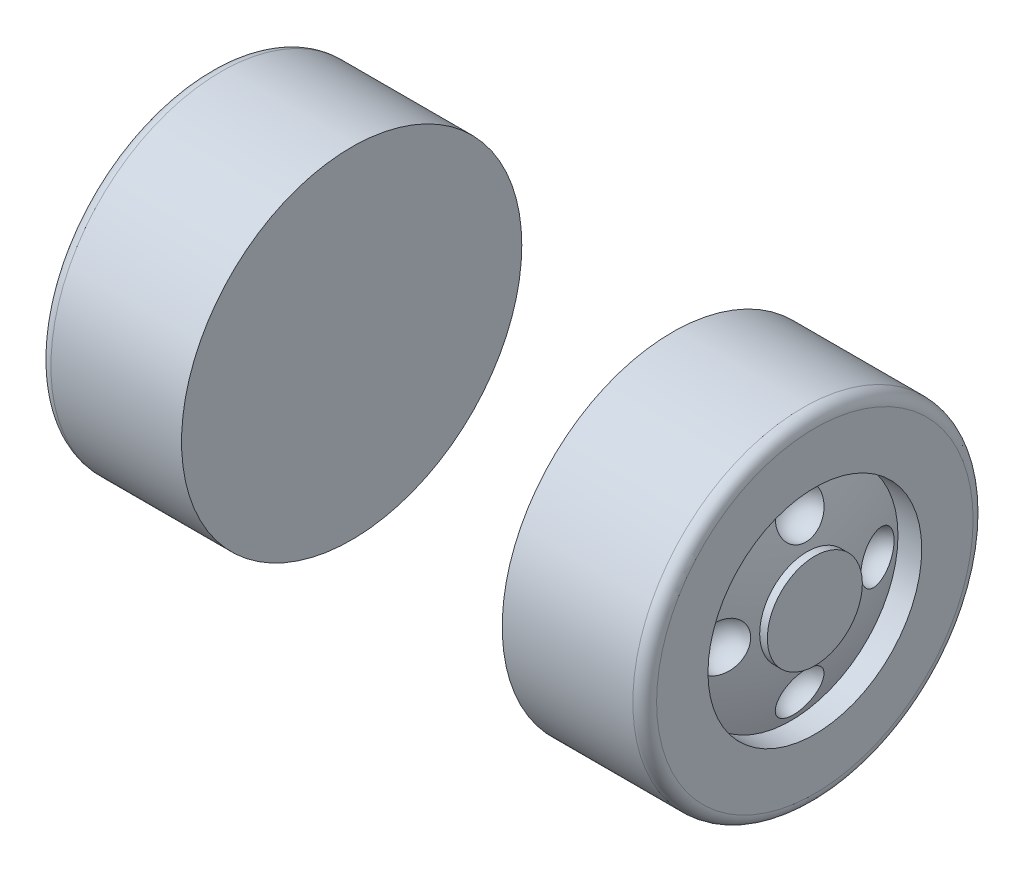
ISO-10303-21;
HEADER;
FILE_DESCRIPTION(('STEP AP214'),'2;1');
FILE_NAME('part.step','',(''),(''),'','','');
FILE_SCHEMA(('AUTOMOTIVE_DESIGN { 1 0 10303 214 1 1 1 1 }'));
ENDSEC;
DATA;
#1=APPLICATION_CONTEXT('core data for automotive mechanical design processes');
#2=APPLICATION_PROTOCOL_DEFINITION('international standard','automotive_design',2000,#1);
#3=PRODUCT_CONTEXT('',#1,'mechanical');
#4=PRODUCT('Part','Part','',(#3));
#5=PRODUCT_RELATED_PRODUCT_CATEGORY('part','',(#4));
#6=PRODUCT_DEFINITION_FORMATION('','',#4);
#7=PRODUCT_DEFINITION_CONTEXT('part definition',#1,'design');
#8=PRODUCT_DEFINITION('design','',#6,#7);
#9=PRODUCT_DEFINITION_SHAPE('','',#8);
#10=(LENGTH_UNIT() NAMED_UNIT(*) SI_UNIT(.MILLI.,.METRE.));
#11=(NAMED_UNIT(*) PLANE_ANGLE_UNIT() SI_UNIT($,.RADIAN.));
#12=(NAMED_UNIT(*) SI_UNIT($,.STERADIAN.) SOLID_ANGLE_UNIT());
#13=UNCERTAINTY_MEASURE_WITH_UNIT(LENGTH_MEASURE(1.E-05),#10,'distance_accuracy_value','');
#14=(GEOMETRIC_REPRESENTATION_CONTEXT(3) GLOBAL_UNCERTAINTY_ASSIGNED_CONTEXT((#13)) GLOBAL_UNIT_ASSIGNED_CONTEXT((#10,
#11,#12)) REPRESENTATION_CONTEXT('',''));
#15=CARTESIAN_POINT('',(0.,0.,0.));
#16=DIRECTION('',(0.,0.,1.));
#17=DIRECTION('',(1.,0.,0.));
#18=AXIS2_PLACEMENT_3D('',#15,#16,#17);
#19=CARTESIAN_POINT('',(-65.0880962103094,-87.375,-14.));
#20=DIRECTION('',(-1.,0.,0.));
#21=DIRECTION('',(0.,0.,1.));
#22=AXIS2_PLACEMENT_3D('',#19,#20,#21);
#23=SPHERICAL_SURFACE('',#22,12.5);
#24=CARTESIAN_POINT('',(-77.1091542566843,-87.375,-10.7202187542405));
#25=DIRECTION('',(0.964737111038161,0.,-0.263215323614989));
#26=DIRECTION('',(-0.263215323614989,0.,-0.964737111038161));
#27=AXIS2_PLACEMENT_3D('',#24,#25,#26);
#28=CIRCLE('',#27,0.993578595607188);
#29=CARTESIAN_POINT('',(-77.370679368264,-87.375,-11.6787608981559));
#30=VERTEX_POINT('',#29);
#31=EDGE_CURVE('E71',#30,#30,#28,.F.);
#32=ORIENTED_EDGE('',*,*,#31,.F.);
#33=EDGE_LOOP('',(#32));
#34=FACE_BOUND('',#33,.T.);
#35=CARTESIAN_POINT('',(-77.1091542566843,-90.6547812457595,-14.));
#36=DIRECTION('',(0.964737111038161,0.263215323614989,0.));
#37=DIRECTION('',(-0.263215323614989,0.964737111038161,0.));
#38=AXIS2_PLACEMENT_3D('',#35,#36,#37);
#39=CIRCLE('',#38,0.993578595607188);
#40=CARTESIAN_POINT('',(-77.370679368264,-89.6962391018441,-14.));
#41=VERTEX_POINT('',#40);
#42=EDGE_CURVE('E77',#41,#41,#39,.F.);
#43=ORIENTED_EDGE('',*,*,#42,.F.);
#44=EDGE_LOOP('',(#43));
#45=FACE_BOUND('',#44,.T.);
#46=CARTESIAN_POINT('',(-77.4270588895624,-87.375,-14.));
#47=DIRECTION('',(-1.,0.,0.));
#48=DIRECTION('',(0.,0.,1.));
#49=AXIS2_PLACEMENT_3D('',#46,#47,#48);
#50=CIRCLE('',#49,2.);
#51=CARTESIAN_POINT('',(-77.4270588895624,-87.375,-12.));
#52=VERTEX_POINT('',#51);
#53=EDGE_CURVE('E60',#52,#52,#50,.F.);
#54=ORIENTED_EDGE('',*,*,#53,.T.);
#55=EDGE_LOOP('',(#54));
#56=FACE_BOUND('',#55,.T.);
#57=CARTESIAN_POINT('',(-76.75,-87.375,-14.));
#58=DIRECTION('',(1.,0.,0.));
#59=DIRECTION('',(0.,0.,-1.));
#60=AXIS2_PLACEMENT_3D('',#57,#58,#59);
#61=CIRCLE('',#60,4.5);
#62=CARTESIAN_POINT('',(-76.75,-87.375,-18.5));
#63=VERTEX_POINT('',#62);
#64=EDGE_CURVE('E82',#63,#63,#61,.T.);
#65=ORIENTED_EDGE('',*,*,#64,.F.);
#66=EDGE_LOOP('',(#65));
#67=FACE_BOUND('',#66,.T.);
#68=CARTESIAN_POINT('',(-77.1091542566843,-87.375,-17.2797812457595));
#69=DIRECTION('',(0.964737111038161,0.,0.263215323614989));
#70=DIRECTION('',(0.263215323614989,0.,-0.964737111038161));
#71=AXIS2_PLACEMENT_3D('',#68,#69,#70);
#72=CIRCLE('',#71,0.993578595607188);
#73=CARTESIAN_POINT('',(-76.8476291451046,-87.375,-18.2383233896749));
#74=VERTEX_POINT('',#73);
#75=EDGE_CURVE('E74',#74,#74,#72,.F.);
#76=ORIENTED_EDGE('',*,*,#75,.F.);
#77=EDGE_LOOP('',(#76));
#78=FACE_BOUND('',#77,.T.);
#79=CARTESIAN_POINT('',(-77.1091542566843,-84.0952187542405,-14.));
#80=DIRECTION('',(0.964737111038161,-0.263215323614989,0.));
#81=DIRECTION('',(0.263215323614989,0.964737111038161,0.));
#82=AXIS2_PLACEMENT_3D('',#79,#80,#81);
#83=CIRCLE('',#82,0.993578595607188);
#84=CARTESIAN_POINT('',(-76.8476291451046,-83.1366766103251,-14.));
#85=VERTEX_POINT('',#84);
#86=EDGE_CURVE('E67',#85,#85,#83,.F.);
#87=ORIENTED_EDGE('',*,*,#86,.F.);
#88=EDGE_LOOP('',(#87));
#89=FACE_BOUND('',#88,.T.);
#90=ADVANCED_FACE('F49',(#34,#45,#56,#67,#78,#89),#23,.T.);
#91=CARTESIAN_POINT('',(-77.75,-87.375,-14.));
#92=DIRECTION('',(1.,0.,0.));
#93=DIRECTION('',(0.,0.,1.));
#94=AXIS2_PLACEMENT_3D('',#91,#92,#93);
#95=CYLINDRICAL_SURFACE('',#94,7.1625);
#96=CARTESIAN_POINT('',(-77.25,-87.375,-14.));
#97=DIRECTION('',(1.,0.,0.));
#98=DIRECTION('',(0.,0.,-1.));
#99=AXIS2_PLACEMENT_3D('',#96,#97,#98);
#100=CIRCLE('',#99,7.1625);
#101=CARTESIAN_POINT('',(-77.25,-87.375,-21.1625));
#102=VERTEX_POINT('',#101);
#103=EDGE_CURVE('E11',#102,#102,#100,.F.);
#104=ORIENTED_EDGE('',*,*,#103,.F.);
#105=EDGE_LOOP('',(#104));
#106=FACE_BOUND('',#105,.T.);
#107=CARTESIAN_POINT('',(-71.75,-87.375,-14.));
#108=DIRECTION('',(1.,0.,0.));
#109=DIRECTION('',(0.,0.,-1.));
#110=AXIS2_PLACEMENT_3D('',#107,#108,#109);
#111=CIRCLE('',#110,7.1625);
#112=CARTESIAN_POINT('',(-71.75,-87.375,-21.1625));
#113=VERTEX_POINT('',#112);
#114=EDGE_CURVE('E64',#113,#113,#111,.T.);
#115=ORIENTED_EDGE('',*,*,#114,.F.);
#116=EDGE_LOOP('',(#115));
#117=FACE_BOUND('',#116,.T.);
#118=ADVANCED_FACE('F108',(#106,#117),#95,.T.);
#119=CARTESIAN_POINT('',(-77.75,0.,0.));
#120=DIRECTION('',(-1.,0.,0.));
#121=DIRECTION('',(0.,0.,-1.));
#122=AXIS2_PLACEMENT_3D('',#119,#120,#121);
#123=PLANE('',#122);
#124=CARTESIAN_POINT('',(-77.75,-87.375,-14.));
#125=DIRECTION('',(1.,0.,0.));
#126=DIRECTION('',(0.,0.,-1.));
#127=AXIS2_PLACEMENT_3D('',#124,#125,#126);
#128=CIRCLE('',#127,6.6625);
#129=CARTESIAN_POINT('',(-77.75,-87.375,-20.6625));
#130=VERTEX_POINT('',#129);
#131=EDGE_CURVE('E56',#130,#130,#128,.T.);
#132=ORIENTED_EDGE('',*,*,#131,.F.);
#133=EDGE_LOOP('',(#132));
#134=FACE_BOUND('',#133,.T.);
#135=CARTESIAN_POINT('',(-77.75,-87.375,-14.));
#136=DIRECTION('',(1.,0.,0.));
#137=DIRECTION('',(0.,0.,-1.));
#138=AXIS2_PLACEMENT_3D('',#135,#136,#137);
#139=CIRCLE('',#138,4.5);
#140=CARTESIAN_POINT('',(-77.75,-87.375,-18.5));
#141=VERTEX_POINT('',#140);
#142=EDGE_CURVE('E83',#141,#141,#139,.T.);
#143=ORIENTED_EDGE('',*,*,#142,.T.);
#144=EDGE_LOOP('',(#143));
#145=FACE_BOUND('',#144,.T.);
#146=ADVANCED_FACE('F114',(#134,#145),#123,.T.);
#147=CARTESIAN_POINT('',(-71.75,0.,0.));
#148=DIRECTION('',(-1.,0.,0.));
#149=DIRECTION('',(0.,0.,-1.));
#150=AXIS2_PLACEMENT_3D('',#147,#148,#149);
#151=PLANE('',#150);
#152=ORIENTED_EDGE('',*,*,#114,.T.);
#153=EDGE_LOOP('',(#152));
#154=FACE_BOUND('',#153,.T.);
#155=ADVANCED_FACE('F121',(#154),#151,.F.);
#156=CARTESIAN_POINT('',(-76.75,-87.375,-14.));
#157=DIRECTION('',(-1.,0.,0.));
#158=DIRECTION('',(0.,0.,-1.));
#159=AXIS2_PLACEMENT_3D('',#156,#157,#158);
#160=CYLINDRICAL_SURFACE('',#159,4.5);
#161=ORIENTED_EDGE('',*,*,#64,.T.);
#162=EDGE_LOOP('',(#161));
#163=FACE_BOUND('',#162,.T.);
#164=ORIENTED_EDGE('',*,*,#142,.F.);
#165=EDGE_LOOP('',(#164));
#166=FACE_BOUND('',#165,.T.);
#167=ADVANCED_FACE('F104',(#163,#166),#160,.F.);
#168=CARTESIAN_POINT('',(-76.75,-87.375,-14.));
#169=DIRECTION('',(-1.,0.,0.));
#170=DIRECTION('',(0.,0.,-1.));
#171=AXIS2_PLACEMENT_3D('',#168,#169,#170);
#172=CYLINDRICAL_SURFACE('',#171,2.);
#173=ORIENTED_EDGE('',*,*,#53,.F.);
#174=EDGE_LOOP('',(#173));
#175=FACE_BOUND('',#174,.T.);
#176=CARTESIAN_POINT('',(-77.75,-87.375,-14.));
#177=DIRECTION('',(1.,0.,0.));
#178=DIRECTION('',(0.,0.,-1.));
#179=AXIS2_PLACEMENT_3D('',#176,#177,#178);
#180=CIRCLE('',#179,2.);
#181=CARTESIAN_POINT('',(-77.75,-87.375,-16.));
#182=VERTEX_POINT('',#181);
#183=EDGE_CURVE('E70',#182,#182,#180,.T.);
#184=ORIENTED_EDGE('',*,*,#183,.T.);
#185=EDGE_LOOP('',(#184));
#186=FACE_BOUND('',#185,.T.);
#187=ADVANCED_FACE('F91',(#175,#186),#172,.T.);
#188=CARTESIAN_POINT('',(-77.75,-87.375,-14.));
#189=DIRECTION('',(-1.,0.,0.));
#190=DIRECTION('',(0.,0.,-1.));
#191=AXIS2_PLACEMENT_3D('',#188,#189,#190);
#192=PLANE('',#191);
#193=ORIENTED_EDGE('',*,*,#183,.F.);
#194=EDGE_LOOP('',(#193));
#195=FACE_BOUND('',#194,.T.);
#196=ADVANCED_FACE('F93',(#195),#192,.T.);
#197=CARTESIAN_POINT('',(-77.,-90.625,-14.));
#198=DIRECTION('',(0.,1.,0.));
#199=DIRECTION('',(0.,0.,-1.));
#200=AXIS2_PLACEMENT_3D('',#197,#198,#199);
#201=SPHERICAL_SURFACE('',#200,1.);
#202=CARTESIAN_POINT('',(-77.,-90.625,-14.));
#203=DIRECTION('',(0.964737111038161,0.263215323614989,0.));
#204=DIRECTION('',(-0.263215323614989,0.964737111038161,0.));
#205=AXIS2_PLACEMENT_3D('',#202,#203,#204);
#206=SPHERICAL_SURFACE('',#205,1.);
#207=ORIENTED_EDGE('',*,*,#42,.T.);
#208=EDGE_LOOP('',(#207));
#209=FACE_BOUND('',#208,.T.);
#210=ADVANCED_FACE('F95',(#209),#206,.F.);
#211=CARTESIAN_POINT('',(-77.,-87.375,-17.25));
#212=DIRECTION('',(0.,0.,1.));
#213=DIRECTION('',(0.,1.,0.));
#214=AXIS2_PLACEMENT_3D('',#211,#212,#213);
#215=SPHERICAL_SURFACE('',#214,1.);
#216=CARTESIAN_POINT('',(-77.,-87.375,-17.25));
#217=DIRECTION('',(0.964737111038161,0.,0.263215323614989));
#218=DIRECTION('',(0.263215323614989,0.,-0.964737111038161));
#219=AXIS2_PLACEMENT_3D('',#216,#217,#218);
#220=SPHERICAL_SURFACE('',#219,1.);
#221=ORIENTED_EDGE('',*,*,#75,.T.);
#222=EDGE_LOOP('',(#221));
#223=FACE_BOUND('',#222,.T.);
#224=ADVANCED_FACE('F101',(#223),#220,.F.);
#225=CARTESIAN_POINT('',(-77.,-87.375,-10.75));
#226=DIRECTION('',(0.,0.,-1.));
#227=DIRECTION('',(0.,-1.,0.));
#228=AXIS2_PLACEMENT_3D('',#225,#226,#227);
#229=SPHERICAL_SURFACE('',#228,1.);
#230=CARTESIAN_POINT('',(-77.,-87.375,-10.75));
#231=DIRECTION('',(0.964737111038161,0.,-0.263215323614989));
#232=DIRECTION('',(-0.263215323614989,0.,-0.964737111038161));
#233=AXIS2_PLACEMENT_3D('',#230,#231,#232);
#234=SPHERICAL_SURFACE('',#233,1.);
#235=ORIENTED_EDGE('',*,*,#31,.T.);
#236=EDGE_LOOP('',(#235));
#237=FACE_BOUND('',#236,.T.);
#238=ADVANCED_FACE('F164',(#237),#234,.F.);
#239=CARTESIAN_POINT('',(-77.,-84.125,-14.));
#240=DIRECTION('',(0.,-1.,0.));
#241=DIRECTION('',(0.,0.,1.));
#242=AXIS2_PLACEMENT_3D('',#239,#240,#241);
#243=SPHERICAL_SURFACE('',#242,1.);
#244=CARTESIAN_POINT('',(-77.,-84.125,-14.));
#245=DIRECTION('',(0.964737111038161,-0.263215323614989,0.));
#246=DIRECTION('',(0.263215323614989,0.964737111038161,0.));
#247=AXIS2_PLACEMENT_3D('',#244,#245,#246);
#248=SPHERICAL_SURFACE('',#247,1.);
#249=ORIENTED_EDGE('',*,*,#86,.T.);
#250=EDGE_LOOP('',(#249));
#251=FACE_BOUND('',#250,.T.);
#252=ADVANCED_FACE('F175',(#251),#248,.F.);
#253=CARTESIAN_POINT('',(-77.25,-87.375,-14.));
#254=DIRECTION('',(-1.,0.,0.));
#255=DIRECTION('',(0.,0.,-1.));
#256=AXIS2_PLACEMENT_3D('',#253,#254,#255);
#257=TOROIDAL_SURFACE('',#256,6.6625,0.5);
#258=ORIENTED_EDGE('',*,*,#103,.T.);
#259=EDGE_LOOP('',(#258));
#260=FACE_BOUND('',#259,.T.);
#261=ORIENTED_EDGE('',*,*,#131,.T.);
#262=EDGE_LOOP('',(#261));
#263=FACE_BOUND('',#262,.T.);
#264=ADVANCED_FACE('F51',(#260,#263),#257,.T.);
#265=CLOSED_SHELL('',(#90,#118,#146,#155,#167,#187,#196,#210,#224,#238,#252,#264));
#266=MANIFOLD_SOLID_BREP('B2',#265);
#267=CARTESIAN_POINT('',(-64.9119037896906,-87.375,-14.));
#268=DIRECTION('',(1.,0.,0.));
#269=DIRECTION('',(0.,0.,1.));
#270=AXIS2_PLACEMENT_3D('',#267,#268,#269);
#271=SPHERICAL_SURFACE('',#270,12.5);
#272=CARTESIAN_POINT('',(-52.8908457433157,-87.375,-10.7202187542405));
#273=DIRECTION('',(0.964737111038161,0.,0.263215323614989));
#274=DIRECTION('',(0.263215323614989,0.,-0.964737111038161));
#275=AXIS2_PLACEMENT_3D('',#272,#273,#274);
#276=CIRCLE('',#275,0.993578595607188);
#277=CARTESIAN_POINT('',(-52.629320631736,-87.375,-11.6787608981559));
#278=VERTEX_POINT('',#277);
#279=EDGE_CURVE('E276',#278,#278,#276,.F.);
#280=ORIENTED_EDGE('',*,*,#279,.T.);
#281=EDGE_LOOP('',(#280));
#282=FACE_BOUND('',#281,.T.);
#283=CARTESIAN_POINT('',(-52.8908457433157,-90.6547812457595,-14.));
#284=DIRECTION('',(0.964737111038161,-0.263215323614989,0.));
#285=DIRECTION('',(0.263215323614989,0.964737111038161,0.));
#286=AXIS2_PLACEMENT_3D('',#283,#284,#285);
#287=CIRCLE('',#286,0.993578595607188);
#288=CARTESIAN_POINT('',(-52.629320631736,-89.6962391018441,-14.));
#289=VERTEX_POINT('',#288);
#290=EDGE_CURVE('E282',#289,#289,#287,.F.);
#291=ORIENTED_EDGE('',*,*,#290,.T.);
#292=EDGE_LOOP('',(#291));
#293=FACE_BOUND('',#292,.T.);
#294=CARTESIAN_POINT('',(-52.5729411104376,-87.375,-14.));
#295=DIRECTION('',(-1.,0.,0.));
#296=DIRECTION('',(0.,0.,1.));
#297=AXIS2_PLACEMENT_3D('',#294,#295,#296);
#298=CIRCLE('',#297,2.);
#299=CARTESIAN_POINT('',(-52.5729411104376,-87.375,-12.));
#300=VERTEX_POINT('',#299);
#301=EDGE_CURVE('E265',#300,#300,#298,.F.);
#302=ORIENTED_EDGE('',*,*,#301,.F.);
#303=EDGE_LOOP('',(#302));
#304=FACE_BOUND('',#303,.T.);
#305=CARTESIAN_POINT('',(-53.25,-87.375,-14.));
#306=DIRECTION('',(1.,0.,0.));
#307=DIRECTION('',(0.,0.,-1.));
#308=AXIS2_PLACEMENT_3D('',#305,#306,#307);
#309=CIRCLE('',#308,4.5);
#310=CARTESIAN_POINT('',(-53.25,-87.375,-18.5));
#311=VERTEX_POINT('',#310);
#312=EDGE_CURVE('E287',#311,#311,#309,.T.);
#313=ORIENTED_EDGE('',*,*,#312,.T.);
#314=EDGE_LOOP('',(#313));
#315=FACE_BOUND('',#314,.T.);
#316=CARTESIAN_POINT('',(-52.8908457433157,-87.375,-17.2797812457595));
#317=DIRECTION('',(0.964737111038161,0.,-0.263215323614989));
#318=DIRECTION('',(-0.263215323614989,0.,-0.964737111038161));
#319=AXIS2_PLACEMENT_3D('',#316,#317,#318);
#320=CIRCLE('',#319,0.993578595607188);
#321=CARTESIAN_POINT('',(-53.1523708548954,-87.375,-18.2383233896749));
#322=VERTEX_POINT('',#321);
#323=EDGE_CURVE('E279',#322,#322,#320,.F.);
#324=ORIENTED_EDGE('',*,*,#323,.T.);
#325=EDGE_LOOP('',(#324));
#326=FACE_BOUND('',#325,.T.);
#327=CARTESIAN_POINT('',(-52.8908457433157,-84.0952187542405,-14.));
#328=DIRECTION('',(0.964737111038161,0.263215323614989,0.));
#329=DIRECTION('',(-0.263215323614989,0.964737111038161,0.));
#330=AXIS2_PLACEMENT_3D('',#327,#328,#329);
#331=CIRCLE('',#330,0.993578595607188);
#332=CARTESIAN_POINT('',(-53.1523708548954,-83.1366766103251,-14.));
#333=VERTEX_POINT('',#332);
#334=EDGE_CURVE('E272',#333,#333,#331,.F.);
#335=ORIENTED_EDGE('',*,*,#334,.T.);
#336=EDGE_LOOP('',(#335));
#337=FACE_BOUND('',#336,.T.);
#338=ADVANCED_FACE('F254',(#282,#293,#304,#315,#326,#337),#271,.T.);
#339=CARTESIAN_POINT('',(-52.25,-87.375,-14.));
#340=DIRECTION('',(-1.,0.,0.));
#341=DIRECTION('',(0.,0.,1.));
#342=AXIS2_PLACEMENT_3D('',#339,#340,#341);
#343=CYLINDRICAL_SURFACE('',#342,7.1625);
#344=CARTESIAN_POINT('',(-52.75,-87.375,-14.));
#345=DIRECTION('',(1.,0.,0.));
#346=DIRECTION('',(0.,0.,-1.));
#347=AXIS2_PLACEMENT_3D('',#344,#345,#346);
#348=CIRCLE('',#347,7.1625);
#349=CARTESIAN_POINT('',(-52.75,-87.375,-21.1625));
#350=VERTEX_POINT('',#349);
#351=EDGE_CURVE('E48',#350,#350,#348,.F.);
#352=ORIENTED_EDGE('',*,*,#351,.T.);
#353=EDGE_LOOP('',(#352));
#354=FACE_BOUND('',#353,.T.);
#355=CARTESIAN_POINT('',(-58.25,-87.375,-14.));
#356=DIRECTION('',(1.,0.,0.));
#357=DIRECTION('',(0.,0.,-1.));
#358=AXIS2_PLACEMENT_3D('',#355,#356,#357);
#359=CIRCLE('',#358,7.1625);
#360=CARTESIAN_POINT('',(-58.25,-87.375,-21.1625));
#361=VERTEX_POINT('',#360);
#362=EDGE_CURVE('E269',#361,#361,#359,.T.);
#363=ORIENTED_EDGE('',*,*,#362,.T.);
#364=EDGE_LOOP('',(#363));
#365=FACE_BOUND('',#364,.T.);
#366=ADVANCED_FACE('F314',(#354,#365),#343,.T.);
#367=CARTESIAN_POINT('',(-52.25,0.,0.));
#368=DIRECTION('',(1.,0.,0.));
#369=DIRECTION('',(0.,0.,-1.));
#370=AXIS2_PLACEMENT_3D('',#367,#368,#369);
#371=PLANE('',#370);
#372=CARTESIAN_POINT('',(-52.25,-87.375,-14.));
#373=DIRECTION('',(1.,0.,0.));
#374=DIRECTION('',(0.,0.,-1.));
#375=AXIS2_PLACEMENT_3D('',#372,#373,#374);
#376=CIRCLE('',#375,6.6625);
#377=CARTESIAN_POINT('',(-52.25,-87.375,-20.6625));
#378=VERTEX_POINT('',#377);
#379=EDGE_CURVE('E261',#378,#378,#376,.T.);
#380=ORIENTED_EDGE('',*,*,#379,.T.);
#381=EDGE_LOOP('',(#380));
#382=FACE_BOUND('',#381,.T.);
#383=CARTESIAN_POINT('',(-52.25,-87.375,-14.));
#384=DIRECTION('',(1.,0.,0.));
#385=DIRECTION('',(0.,0.,-1.));
#386=AXIS2_PLACEMENT_3D('',#383,#384,#385);
#387=CIRCLE('',#386,4.5);
#388=CARTESIAN_POINT('',(-52.25,-87.375,-18.5));
#389=VERTEX_POINT('',#388);
#390=EDGE_CURVE('E288',#389,#389,#387,.T.);
#391=ORIENTED_EDGE('',*,*,#390,.F.);
#392=EDGE_LOOP('',(#391));
#393=FACE_BOUND('',#392,.T.);
#394=ADVANCED_FACE('F319',(#382,#393),#371,.T.);
#395=CARTESIAN_POINT('',(-58.25,0.,0.));
#396=DIRECTION('',(1.,0.,0.));
#397=DIRECTION('',(0.,0.,-1.));
#398=AXIS2_PLACEMENT_3D('',#395,#396,#397);
#399=PLANE('',#398);
#400=ORIENTED_EDGE('',*,*,#362,.F.);
#401=EDGE_LOOP('',(#400));
#402=FACE_BOUND('',#401,.T.);
#403=ADVANCED_FACE('F309',(#402),#399,.F.);
#404=CARTESIAN_POINT('',(-53.25,-87.375,-14.));
#405=DIRECTION('',(1.,0.,0.));
#406=DIRECTION('',(0.,0.,-1.));
#407=AXIS2_PLACEMENT_3D('',#404,#405,#406);
#408=CYLINDRICAL_SURFACE('',#407,4.5);
#409=ORIENTED_EDGE('',*,*,#312,.F.);
#410=EDGE_LOOP('',(#409));
#411=FACE_BOUND('',#410,.T.);
#412=ORIENTED_EDGE('',*,*,#390,.T.);
#413=EDGE_LOOP('',(#412));
#414=FACE_BOUND('',#413,.T.);
#415=ADVANCED_FACE('F300',(#411,#414),#408,.F.);
#416=CARTESIAN_POINT('',(-53.25,-87.375,-14.));
#417=DIRECTION('',(1.,0.,0.));
#418=DIRECTION('',(0.,0.,-1.));
#419=AXIS2_PLACEMENT_3D('',#416,#417,#418);
#420=CYLINDRICAL_SURFACE('',#419,2.);
#421=ORIENTED_EDGE('',*,*,#301,.T.);
#422=EDGE_LOOP('',(#421));
#423=FACE_BOUND('',#422,.T.);
#424=CARTESIAN_POINT('',(-52.25,-87.375,-14.));
#425=DIRECTION('',(1.,0.,0.));
#426=DIRECTION('',(0.,0.,-1.));
#427=AXIS2_PLACEMENT_3D('',#424,#425,#426);
#428=CIRCLE('',#427,2.);
#429=CARTESIAN_POINT('',(-52.25,-87.375,-16.));
#430=VERTEX_POINT('',#429);
#431=EDGE_CURVE('E275',#430,#430,#428,.T.);
#432=ORIENTED_EDGE('',*,*,#431,.F.);
#433=EDGE_LOOP('',(#432));
#434=FACE_BOUND('',#433,.T.);
#435=ADVANCED_FACE('F298',(#423,#434),#420,.T.);
#436=CARTESIAN_POINT('',(-52.25,-87.375,-14.));
#437=DIRECTION('',(1.,0.,0.));
#438=DIRECTION('',(0.,0.,-1.));
#439=AXIS2_PLACEMENT_3D('',#436,#437,#438);
#440=PLANE('',#439);
#441=ORIENTED_EDGE('',*,*,#431,.T.);
#442=EDGE_LOOP('',(#441));
#443=FACE_BOUND('',#442,.T.);
#444=ADVANCED_FACE('F296',(#443),#440,.T.);
#445=CARTESIAN_POINT('',(-53.,-90.625,-14.));
#446=DIRECTION('',(0.,1.,0.));
#447=DIRECTION('',(0.,0.,-1.));
#448=AXIS2_PLACEMENT_3D('',#445,#446,#447);
#449=SPHERICAL_SURFACE('',#448,1.);
#450=CARTESIAN_POINT('',(-53.,-90.625,-14.));
#451=DIRECTION('',(0.964737111038161,-0.263215323614989,0.));
#452=DIRECTION('',(0.263215323614989,0.964737111038161,0.));
#453=AXIS2_PLACEMENT_3D('',#450,#451,#452);
#454=SPHERICAL_SURFACE('',#453,1.);
#455=ORIENTED_EDGE('',*,*,#290,.F.);
#456=EDGE_LOOP('',(#455));
#457=FACE_BOUND('',#456,.T.);
#458=ADVANCED_FACE('F307',(#457),#454,.F.);
#459=CARTESIAN_POINT('',(-53.,-87.375,-17.25));
#460=DIRECTION('',(0.,0.,1.));
#461=DIRECTION('',(0.,1.,0.));
#462=AXIS2_PLACEMENT_3D('',#459,#460,#461);
#463=SPHERICAL_SURFACE('',#462,1.);
#464=CARTESIAN_POINT('',(-53.,-87.375,-17.25));
#465=DIRECTION('',(0.964737111038161,0.,-0.263215323614989));
#466=DIRECTION('',(-0.263215323614989,0.,-0.964737111038161));
#467=AXIS2_PLACEMENT_3D('',#464,#465,#466);
#468=SPHERICAL_SURFACE('',#467,1.);
#469=ORIENTED_EDGE('',*,*,#323,.F.);
#470=EDGE_LOOP('',(#469));
#471=FACE_BOUND('',#470,.T.);
#472=ADVANCED_FACE('F368',(#471),#468,.F.);
#473=CARTESIAN_POINT('',(-53.,-87.375,-10.75));
#474=DIRECTION('',(0.,0.,-1.));
#475=DIRECTION('',(0.,-1.,0.));
#476=AXIS2_PLACEMENT_3D('',#473,#474,#475);
#477=SPHERICAL_SURFACE('',#476,1.);
#478=CARTESIAN_POINT('',(-53.,-87.375,-10.75));
#479=DIRECTION('',(0.964737111038161,0.,0.263215323614989));
#480=DIRECTION('',(0.263215323614989,0.,-0.964737111038161));
#481=AXIS2_PLACEMENT_3D('',#478,#479,#480);
#482=SPHERICAL_SURFACE('',#481,1.);
#483=ORIENTED_EDGE('',*,*,#279,.F.);
#484=EDGE_LOOP('',(#483));
#485=FACE_BOUND('',#484,.T.);
#486=ADVANCED_FACE('F357',(#485),#482,.F.);
#487=CARTESIAN_POINT('',(-53.,-84.125,-14.));
#488=DIRECTION('',(0.,-1.,0.));
#489=DIRECTION('',(0.,0.,1.));
#490=AXIS2_PLACEMENT_3D('',#487,#488,#489);
#491=SPHERICAL_SURFACE('',#490,1.);
#492=CARTESIAN_POINT('',(-53.,-84.125,-14.));
#493=DIRECTION('',(0.964737111038161,0.263215323614989,0.));
#494=DIRECTION('',(-0.263215323614989,0.964737111038161,0.));
#495=AXIS2_PLACEMENT_3D('',#492,#493,#494);
#496=SPHERICAL_SURFACE('',#495,1.);
#497=ORIENTED_EDGE('',*,*,#334,.F.);
#498=EDGE_LOOP('',(#497));
#499=FACE_BOUND('',#498,.T.);
#500=ADVANCED_FACE('F352',(#499),#496,.F.);
#501=CARTESIAN_POINT('',(-52.75,-87.375,-14.));
#502=DIRECTION('',(1.,0.,0.));
#503=DIRECTION('',(0.,0.,-1.));
#504=AXIS2_PLACEMENT_3D('',#501,#502,#503);
#505=TOROIDAL_SURFACE('',#504,6.6625,0.5);
#506=ORIENTED_EDGE('',*,*,#351,.F.);
#507=EDGE_LOOP('',(#506));
#508=FACE_BOUND('',#507,.T.);
#509=ORIENTED_EDGE('',*,*,#379,.F.);
#510=EDGE_LOOP('',(#509));
#511=FACE_BOUND('',#510,.T.);
#512=ADVANCED_FACE('F256',(#508,#511),#505,.T.);
#513=CLOSED_SHELL('',(#338,#366,#394,#403,#415,#435,#444,#458,#472,#486,#500,#512));
#514=MANIFOLD_SOLID_BREP('B6',#513);
#515=ADVANCED_BREP_SHAPE_REPRESENTATION('',(#18,#266,#514),#14);
#516=SHAPE_DEFINITION_REPRESENTATION(#9,#515);
ENDSEC;
END-ISO-10303-21;
